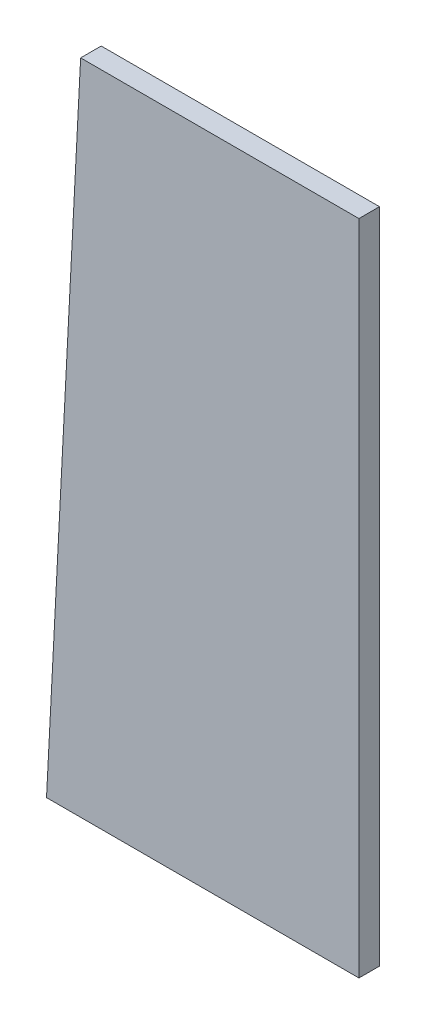
ISO-10303-21;
HEADER;
FILE_DESCRIPTION(('STEP AP214'),'2;1');
FILE_NAME('part.step','',(''),(''),'','','');
FILE_SCHEMA(('AUTOMOTIVE_DESIGN { 1 0 10303 214 1 1 1 1 }'));
ENDSEC;
DATA;
#1=APPLICATION_CONTEXT('core data for automotive mechanical design processes');
#2=APPLICATION_PROTOCOL_DEFINITION('international standard','automotive_design',2000,#1);
#3=PRODUCT_CONTEXT('',#1,'mechanical');
#4=PRODUCT('Part','Part','',(#3));
#5=PRODUCT_RELATED_PRODUCT_CATEGORY('part','',(#4));
#6=PRODUCT_DEFINITION_FORMATION('','',#4);
#7=PRODUCT_DEFINITION_CONTEXT('part definition',#1,'design');
#8=PRODUCT_DEFINITION('design','',#6,#7);
#9=PRODUCT_DEFINITION_SHAPE('','',#8);
#10=(LENGTH_UNIT() NAMED_UNIT(*) SI_UNIT(.MILLI.,.METRE.));
#11=(NAMED_UNIT(*) PLANE_ANGLE_UNIT() SI_UNIT($,.RADIAN.));
#12=(NAMED_UNIT(*) SI_UNIT($,.STERADIAN.) SOLID_ANGLE_UNIT());
#13=UNCERTAINTY_MEASURE_WITH_UNIT(LENGTH_MEASURE(1.E-05),#10,'distance_accuracy_value','');
#14=(GEOMETRIC_REPRESENTATION_CONTEXT(3) GLOBAL_UNCERTAINTY_ASSIGNED_CONTEXT((#13)) GLOBAL_UNIT_ASSIGNED_CONTEXT((#10,
#11,#12)) REPRESENTATION_CONTEXT('',''));
#15=CARTESIAN_POINT('',(0.,0.,0.));
#16=DIRECTION('',(0.,0.,1.));
#17=DIRECTION('',(1.,0.,0.));
#18=AXIS2_PLACEMENT_3D('',#15,#16,#17);
#19=CARTESIAN_POINT('',(12.065,0.,1.5875));
#20=DIRECTION('',(1.,0.,0.));
#21=DIRECTION('',(0.,1.,0.));
#22=AXIS2_PLACEMENT_3D('',#19,#20,#21);
#23=PLANE('',#22);
#24=DIRECTION('',(0.,-1.,0.));
#25=VECTOR('',#24,1.);
#26=CARTESIAN_POINT('',(12.065,0.,0.));
#27=LINE('',#26,#25);
#28=CARTESIAN_POINT('',(12.065,25.4,0.));
#29=VERTEX_POINT('',#28);
#30=CARTESIAN_POINT('',(12.065,-25.4,0.));
#31=VERTEX_POINT('',#30);
#32=EDGE_CURVE('E104',#29,#31,#27,.T.);
#33=ORIENTED_EDGE('',*,*,#32,.F.);
#34=DIRECTION('',(0.,0.,-1.));
#35=VECTOR('',#34,1.);
#36=CARTESIAN_POINT('',(12.065,25.4,1.5875));
#37=LINE('',#36,#35);
#38=CARTESIAN_POINT('',(12.065,25.4,1.5875));
#39=VERTEX_POINT('',#38);
#40=EDGE_CURVE('E11',#39,#29,#37,.T.);
#41=ORIENTED_EDGE('',*,*,#40,.F.);
#42=DIRECTION('',(0.,-1.,0.));
#43=VECTOR('',#42,1.);
#44=CARTESIAN_POINT('',(12.065,0.,1.5875));
#45=LINE('',#44,#43);
#46=CARTESIAN_POINT('',(12.065,-25.4,1.5875));
#47=VERTEX_POINT('',#46);
#48=EDGE_CURVE('E97',#39,#47,#45,.T.);
#49=ORIENTED_EDGE('',*,*,#48,.T.);
#50=DIRECTION('',(0.,0.,-1.));
#51=VECTOR('',#50,1.);
#52=CARTESIAN_POINT('',(12.065,-25.4,1.5875));
#53=LINE('',#52,#51);
#54=EDGE_CURVE('E79',#47,#31,#53,.T.);
#55=ORIENTED_EDGE('',*,*,#54,.T.);
#56=EDGE_LOOP('',(#33,#41,#49,#55));
#57=FACE_BOUND('',#56,.T.);
#58=ADVANCED_FACE('F41',(#57),#23,.T.);
#59=CARTESIAN_POINT('',(0.,25.4,1.5875));
#60=DIRECTION('',(0.,1.,0.));
#61=DIRECTION('',(0.,0.,1.));
#62=AXIS2_PLACEMENT_3D('',#59,#60,#61);
#63=PLANE('',#62);
#64=DIRECTION('',(1.,0.,0.));
#65=VECTOR('',#64,1.);
#66=CARTESIAN_POINT('',(0.,25.4,0.));
#67=LINE('',#66,#65);
#68=CARTESIAN_POINT('',(-9.42913168485473,25.4,0.));
#69=VERTEX_POINT('',#68);
#70=EDGE_CURVE('E90',#69,#29,#67,.T.);
#71=ORIENTED_EDGE('',*,*,#70,.F.);
#72=DIRECTION('',(0.,0.,-1.));
#73=VECTOR('',#72,1.);
#74=CARTESIAN_POINT('',(-9.42913168485473,25.4,1.5875));
#75=LINE('',#74,#73);
#76=CARTESIAN_POINT('',(-9.42913168485473,25.4,1.5875));
#77=VERTEX_POINT('',#76);
#78=EDGE_CURVE('E49',#77,#69,#75,.T.);
#79=ORIENTED_EDGE('',*,*,#78,.F.);
#80=DIRECTION('',(1.,0.,0.));
#81=VECTOR('',#80,1.);
#82=CARTESIAN_POINT('',(0.,25.4,1.5875));
#83=LINE('',#82,#81);
#84=EDGE_CURVE('E88',#77,#39,#83,.T.);
#85=ORIENTED_EDGE('',*,*,#84,.T.);
#86=ORIENTED_EDGE('',*,*,#40,.T.);
#87=EDGE_LOOP('',(#71,#79,#85,#86));
#88=FACE_BOUND('',#87,.T.);
#89=ADVANCED_FACE('F87',(#88),#63,.T.);
#90=CARTESIAN_POINT('',(-10.7182094368273,0.556137571842993,1.5875));
#91=DIRECTION('',(-0.998656572766337,0.0518174649186289,0.));
#92=DIRECTION('',(-0.0518174649186289,-0.998656572766337,0.));
#93=AXIS2_PLACEMENT_3D('',#90,#91,#92);
#94=PLANE('',#93);
#95=DIRECTION('',(0.0518174649186289,0.998656572766337,0.));
#96=VECTOR('',#95,1.);
#97=CARTESIAN_POINT('',(-10.7182094368273,0.556137571842993,0.));
#98=LINE('',#97,#96);
#99=CARTESIAN_POINT('',(-12.065,-25.4,0.));
#100=VERTEX_POINT('',#99);
#101=EDGE_CURVE('E108',#100,#69,#98,.T.);
#102=ORIENTED_EDGE('',*,*,#101,.F.);
#103=DIRECTION('',(0.,0.,-1.));
#104=VECTOR('',#103,1.);
#105=CARTESIAN_POINT('',(-12.065,-25.4,1.5875));
#106=LINE('',#105,#104);
#107=CARTESIAN_POINT('',(-12.065,-25.4,1.5875));
#108=VERTEX_POINT('',#107);
#109=EDGE_CURVE('E72',#108,#100,#106,.T.);
#110=ORIENTED_EDGE('',*,*,#109,.F.);
#111=DIRECTION('',(0.0518174649186289,0.998656572766337,0.));
#112=VECTOR('',#111,1.);
#113=CARTESIAN_POINT('',(-10.7182094368273,0.556137571842993,1.5875));
#114=LINE('',#113,#112);
#115=EDGE_CURVE('E96',#108,#77,#114,.T.);
#116=ORIENTED_EDGE('',*,*,#115,.T.);
#117=ORIENTED_EDGE('',*,*,#78,.T.);
#118=EDGE_LOOP('',(#102,#110,#116,#117));
#119=FACE_BOUND('',#118,.T.);
#120=ADVANCED_FACE('F99',(#119),#94,.T.);
#121=CARTESIAN_POINT('',(0.,-25.4,1.5875));
#122=DIRECTION('',(0.,1.,0.));
#123=DIRECTION('',(0.,0.,1.));
#124=AXIS2_PLACEMENT_3D('',#121,#122,#123);
#125=PLANE('',#124);
#126=DIRECTION('',(1.,0.,0.));
#127=VECTOR('',#126,1.);
#128=CARTESIAN_POINT('',(0.,-25.4,0.));
#129=LINE('',#128,#127);
#130=EDGE_CURVE('E110',#100,#31,#129,.T.);
#131=ORIENTED_EDGE('',*,*,#130,.T.);
#132=ORIENTED_EDGE('',*,*,#54,.F.);
#133=DIRECTION('',(1.,0.,0.));
#134=VECTOR('',#133,1.);
#135=CARTESIAN_POINT('',(0.,-25.4,1.5875));
#136=LINE('',#135,#134);
#137=EDGE_CURVE('E57',#108,#47,#136,.T.);
#138=ORIENTED_EDGE('',*,*,#137,.F.);
#139=ORIENTED_EDGE('',*,*,#109,.T.);
#140=EDGE_LOOP('',(#131,#132,#138,#139));
#141=FACE_BOUND('',#140,.T.);
#142=ADVANCED_FACE('F120',(#141),#125,.F.);
#143=CARTESIAN_POINT('',(0.,0.,1.5875));
#144=DIRECTION('',(0.,0.,1.));
#145=DIRECTION('',(1.,0.,0.));
#146=AXIS2_PLACEMENT_3D('',#143,#144,#145);
#147=PLANE('',#146);
#148=ORIENTED_EDGE('',*,*,#48,.F.);
#149=ORIENTED_EDGE('',*,*,#84,.F.);
#150=ORIENTED_EDGE('',*,*,#115,.F.);
#151=ORIENTED_EDGE('',*,*,#137,.T.);
#152=EDGE_LOOP('',(#148,#149,#150,#151));
#153=FACE_BOUND('',#152,.T.);
#154=ADVANCED_FACE('F95',(#153),#147,.T.);
#155=CARTESIAN_POINT('',(0.,0.,0.));
#156=DIRECTION('',(0.,0.,1.));
#157=DIRECTION('',(1.,0.,0.));
#158=AXIS2_PLACEMENT_3D('',#155,#156,#157);
#159=PLANE('',#158);
#160=ORIENTED_EDGE('',*,*,#32,.T.);
#161=ORIENTED_EDGE('',*,*,#130,.F.);
#162=ORIENTED_EDGE('',*,*,#101,.T.);
#163=ORIENTED_EDGE('',*,*,#70,.T.);
#164=EDGE_LOOP('',(#160,#161,#162,#163));
#165=FACE_BOUND('',#164,.T.);
#166=ADVANCED_FACE('F125',(#165),#159,.F.);
#167=CLOSED_SHELL('',(#58,#89,#120,#142,#154,#166));
#168=MANIFOLD_SOLID_BREP('B2',#167);
#169=ADVANCED_BREP_SHAPE_REPRESENTATION('',(#18,#168),#14);
#170=SHAPE_DEFINITION_REPRESENTATION(#9,#169);
ENDSEC;
END-ISO-10303-21;
